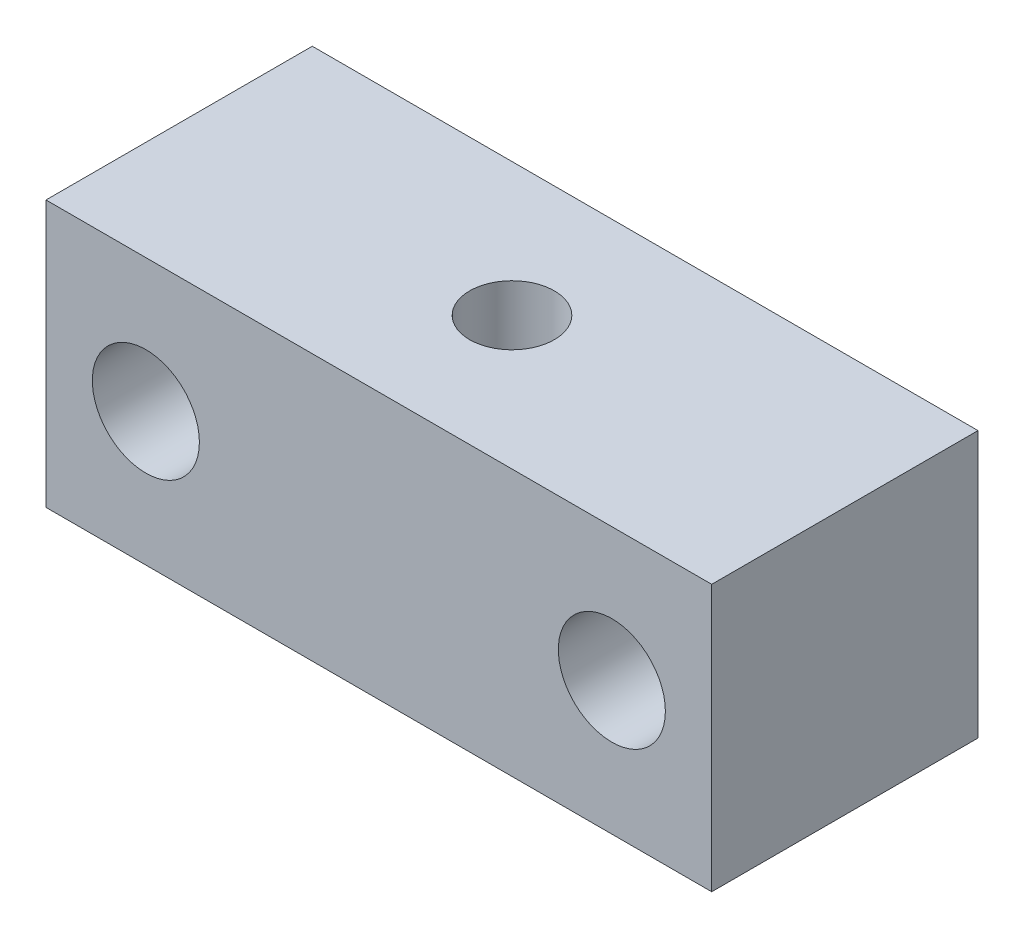
ISO-10303-21;
HEADER;
FILE_DESCRIPTION(('STEP AP214'),'2;1');
FILE_NAME('part.step','',(''),(''),'','','');
FILE_SCHEMA(('AUTOMOTIVE_DESIGN { 1 0 10303 214 1 1 1 1 }'));
ENDSEC;
DATA;
#1=APPLICATION_CONTEXT('core data for automotive mechanical design processes');
#2=APPLICATION_PROTOCOL_DEFINITION('international standard','automotive_design',2000,#1);
#3=PRODUCT_CONTEXT('',#1,'mechanical');
#4=PRODUCT('Part','Part','',(#3));
#5=PRODUCT_RELATED_PRODUCT_CATEGORY('part','',(#4));
#6=PRODUCT_DEFINITION_FORMATION('','',#4);
#7=PRODUCT_DEFINITION_CONTEXT('part definition',#1,'design');
#8=PRODUCT_DEFINITION('design','',#6,#7);
#9=PRODUCT_DEFINITION_SHAPE('','',#8);
#10=(LENGTH_UNIT() NAMED_UNIT(*) SI_UNIT(.MILLI.,.METRE.));
#11=(NAMED_UNIT(*) PLANE_ANGLE_UNIT() SI_UNIT($,.RADIAN.));
#12=(NAMED_UNIT(*) SI_UNIT($,.STERADIAN.) SOLID_ANGLE_UNIT());
#13=UNCERTAINTY_MEASURE_WITH_UNIT(LENGTH_MEASURE(1.E-05),#10,'distance_accuracy_value','');
#14=(GEOMETRIC_REPRESENTATION_CONTEXT(3) GLOBAL_UNCERTAINTY_ASSIGNED_CONTEXT((#13)) GLOBAL_UNIT_ASSIGNED_CONTEXT((#10,
#11,#12)) REPRESENTATION_CONTEXT('',''));
#15=CARTESIAN_POINT('',(0.,0.,0.));
#16=DIRECTION('',(0.,0.,1.));
#17=DIRECTION('',(1.,0.,0.));
#18=AXIS2_PLACEMENT_3D('',#15,#16,#17);
#19=CARTESIAN_POINT('',(0.,0.,6.35));
#20=DIRECTION('',(1.,0.,0.));
#21=DIRECTION('',(0.,0.,-1.));
#22=AXIS2_PLACEMENT_3D('',#19,#20,#21);
#23=PLANE('',#22);
#24=DIRECTION('',(0.,-1.,0.));
#25=VECTOR('',#24,1.);
#26=CARTESIAN_POINT('',(0.,0.,-6.35));
#27=LINE('',#26,#25);
#28=CARTESIAN_POINT('',(0.,12.7,-6.35));
#29=VERTEX_POINT('',#28);
#30=CARTESIAN_POINT('',(0.,0.,-6.35));
#31=VERTEX_POINT('',#30);
#32=EDGE_CURVE('E102',#29,#31,#27,.T.);
#33=ORIENTED_EDGE('',*,*,#32,.T.);
#34=DIRECTION('',(0.,0.,-1.));
#35=VECTOR('',#34,1.);
#36=CARTESIAN_POINT('',(0.,0.,6.35));
#37=LINE('',#36,#35);
#38=CARTESIAN_POINT('',(0.,0.,6.35));
#39=VERTEX_POINT('',#38);
#40=EDGE_CURVE('E11',#39,#31,#37,.T.);
#41=ORIENTED_EDGE('',*,*,#40,.F.);
#42=DIRECTION('',(0.,-1.,0.));
#43=VECTOR('',#42,1.);
#44=CARTESIAN_POINT('',(0.,0.,6.35));
#45=LINE('',#44,#43);
#46=CARTESIAN_POINT('',(0.,12.7,6.35));
#47=VERTEX_POINT('',#46);
#48=EDGE_CURVE('E90',#47,#39,#45,.T.);
#49=ORIENTED_EDGE('',*,*,#48,.F.);
#50=DIRECTION('',(0.,0.,-1.));
#51=VECTOR('',#50,1.);
#52=CARTESIAN_POINT('',(0.,12.7,6.35));
#53=LINE('',#52,#51);
#54=EDGE_CURVE('E98',#47,#29,#53,.T.);
#55=ORIENTED_EDGE('',*,*,#54,.T.);
#56=EDGE_LOOP('',(#33,#41,#49,#55));
#57=FACE_BOUND('',#56,.T.);
#58=ADVANCED_FACE('F39',(#57),#23,.F.);
#59=CARTESIAN_POINT('',(0.,0.,6.35));
#60=DIRECTION('',(0.,1.,0.));
#61=DIRECTION('',(0.,0.,1.));
#62=AXIS2_PLACEMENT_3D('',#59,#60,#61);
#63=PLANE('',#62);
#64=CARTESIAN_POINT('',(15.875,0.,0.));
#65=DIRECTION('',(0.,1.,0.));
#66=DIRECTION('',(0.,0.,1.));
#67=AXIS2_PLACEMENT_3D('',#64,#65,#66);
#68=CIRCLE('',#67,2.0193);
#69=CARTESIAN_POINT('',(15.875,0.,2.0193));
#70=VERTEX_POINT('',#69);
#71=EDGE_CURVE('E120',#70,#70,#68,.T.);
#72=ORIENTED_EDGE('',*,*,#71,.T.);
#73=EDGE_LOOP('',(#72));
#74=FACE_BOUND('',#73,.T.);
#75=DIRECTION('',(1.,0.,0.));
#76=VECTOR('',#75,1.);
#77=CARTESIAN_POINT('',(0.,0.,-6.35));
#78=LINE('',#77,#76);
#79=CARTESIAN_POINT('',(31.75,0.,-6.35));
#80=VERTEX_POINT('',#79);
#81=EDGE_CURVE('E94',#31,#80,#78,.T.);
#82=ORIENTED_EDGE('',*,*,#81,.T.);
#83=DIRECTION('',(0.,0.,-1.));
#84=VECTOR('',#83,1.);
#85=CARTESIAN_POINT('',(31.75,0.,6.35));
#86=LINE('',#85,#84);
#87=CARTESIAN_POINT('',(31.75,0.,6.35));
#88=VERTEX_POINT('',#87);
#89=EDGE_CURVE('E47',#88,#80,#86,.T.);
#90=ORIENTED_EDGE('',*,*,#89,.F.);
#91=DIRECTION('',(1.,0.,0.));
#92=VECTOR('',#91,1.);
#93=CARTESIAN_POINT('',(0.,0.,6.35));
#94=LINE('',#93,#92);
#95=EDGE_CURVE('E85',#39,#88,#94,.T.);
#96=ORIENTED_EDGE('',*,*,#95,.F.);
#97=ORIENTED_EDGE('',*,*,#40,.T.);
#98=EDGE_LOOP('',(#82,#90,#96,#97));
#99=FACE_BOUND('',#98,.T.);
#100=ADVANCED_FACE('F93',(#74,#99),#63,.F.);
#101=CARTESIAN_POINT('',(31.75,0.,6.35));
#102=DIRECTION('',(-1.,0.,0.));
#103=DIRECTION('',(0.,0.,1.));
#104=AXIS2_PLACEMENT_3D('',#101,#102,#103);
#105=PLANE('',#104);
#106=DIRECTION('',(0.,1.,0.));
#107=VECTOR('',#106,1.);
#108=CARTESIAN_POINT('',(31.75,0.,-6.35));
#109=LINE('',#108,#107);
#110=CARTESIAN_POINT('',(31.75,12.7,-6.35));
#111=VERTEX_POINT('',#110);
#112=EDGE_CURVE('E72',#80,#111,#109,.T.);
#113=ORIENTED_EDGE('',*,*,#112,.T.);
#114=DIRECTION('',(0.,0.,-1.));
#115=VECTOR('',#114,1.);
#116=CARTESIAN_POINT('',(31.75,12.7,6.35));
#117=LINE('',#116,#115);
#118=CARTESIAN_POINT('',(31.75,12.7,6.35));
#119=VERTEX_POINT('',#118);
#120=EDGE_CURVE('E95',#119,#111,#117,.T.);
#121=ORIENTED_EDGE('',*,*,#120,.F.);
#122=DIRECTION('',(0.,1.,0.));
#123=VECTOR('',#122,1.);
#124=CARTESIAN_POINT('',(31.75,0.,6.35));
#125=LINE('',#124,#123);
#126=EDGE_CURVE('E88',#88,#119,#125,.T.);
#127=ORIENTED_EDGE('',*,*,#126,.F.);
#128=ORIENTED_EDGE('',*,*,#89,.T.);
#129=EDGE_LOOP('',(#113,#121,#127,#128));
#130=FACE_BOUND('',#129,.T.);
#131=ADVANCED_FACE('F96',(#130),#105,.F.);
#132=CARTESIAN_POINT('',(0.,12.7,6.35));
#133=DIRECTION('',(0.,-1.,0.));
#134=DIRECTION('',(0.,0.,-1.));
#135=AXIS2_PLACEMENT_3D('',#132,#133,#134);
#136=PLANE('',#135);
#137=CARTESIAN_POINT('',(15.875,12.7,0.));
#138=DIRECTION('',(0.,1.,0.));
#139=DIRECTION('',(0.,0.,1.));
#140=AXIS2_PLACEMENT_3D('',#137,#138,#139);
#141=CIRCLE('',#140,2.01929999999999);
#142=CARTESIAN_POINT('',(15.875,12.7,2.01929999999999));
#143=VERTEX_POINT('',#142);
#144=EDGE_CURVE('E130',#143,#143,#141,.T.);
#145=ORIENTED_EDGE('',*,*,#144,.F.);
#146=EDGE_LOOP('',(#145));
#147=FACE_BOUND('',#146,.T.);
#148=DIRECTION('',(-1.,0.,0.));
#149=VECTOR('',#148,1.);
#150=CARTESIAN_POINT('',(0.,12.7,-6.35));
#151=LINE('',#150,#149);
#152=EDGE_CURVE('E78',#111,#29,#151,.T.);
#153=ORIENTED_EDGE('',*,*,#152,.T.);
#154=ORIENTED_EDGE('',*,*,#54,.F.);
#155=DIRECTION('',(-1.,0.,0.));
#156=VECTOR('',#155,1.);
#157=CARTESIAN_POINT('',(0.,12.7,6.35));
#158=LINE('',#157,#156);
#159=EDGE_CURVE('E55',#119,#47,#158,.T.);
#160=ORIENTED_EDGE('',*,*,#159,.F.);
#161=ORIENTED_EDGE('',*,*,#120,.T.);
#162=EDGE_LOOP('',(#153,#154,#160,#161));
#163=FACE_BOUND('',#162,.T.);
#164=ADVANCED_FACE('F110',(#147,#163),#136,.F.);
#165=CARTESIAN_POINT('',(0.,0.,6.35));
#166=DIRECTION('',(0.,0.,-1.));
#167=DIRECTION('',(-1.,0.,0.));
#168=AXIS2_PLACEMENT_3D('',#165,#166,#167);
#169=PLANE('',#168);
#170=CARTESIAN_POINT('',(4.7625,6.35,6.35));
#171=DIRECTION('',(0.,0.,1.));
#172=DIRECTION('',(1.,0.,0.));
#173=AXIS2_PLACEMENT_3D('',#170,#171,#172);
#174=CIRCLE('',#173,2.5527);
#175=CARTESIAN_POINT('',(7.3152,6.35,6.35));
#176=VERTEX_POINT('',#175);
#177=EDGE_CURVE('E123',#176,#176,#174,.T.);
#178=ORIENTED_EDGE('',*,*,#177,.F.);
#179=EDGE_LOOP('',(#178));
#180=FACE_BOUND('',#179,.T.);
#181=CARTESIAN_POINT('',(26.9875,6.35,6.35));
#182=DIRECTION('',(0.,0.,1.));
#183=DIRECTION('',(1.,0.,0.));
#184=AXIS2_PLACEMENT_3D('',#181,#182,#183);
#185=CIRCLE('',#184,2.5527);
#186=CARTESIAN_POINT('',(29.5402,6.35,6.35));
#187=VERTEX_POINT('',#186);
#188=EDGE_CURVE('E116',#187,#187,#185,.T.);
#189=ORIENTED_EDGE('',*,*,#188,.F.);
#190=EDGE_LOOP('',(#189));
#191=FACE_BOUND('',#190,.T.);
#192=ORIENTED_EDGE('',*,*,#48,.T.);
#193=ORIENTED_EDGE('',*,*,#95,.T.);
#194=ORIENTED_EDGE('',*,*,#126,.T.);
#195=ORIENTED_EDGE('',*,*,#159,.T.);
#196=EDGE_LOOP('',(#192,#193,#194,#195));
#197=FACE_BOUND('',#196,.T.);
#198=ADVANCED_FACE('F86',(#180,#191,#197),#169,.F.);
#199=CARTESIAN_POINT('',(0.,0.,-6.35));
#200=DIRECTION('',(0.,0.,-1.));
#201=DIRECTION('',(-1.,0.,0.));
#202=AXIS2_PLACEMENT_3D('',#199,#200,#201);
#203=PLANE('',#202);
#204=CARTESIAN_POINT('',(4.7625,6.35,-6.35));
#205=DIRECTION('',(0.,0.,1.));
#206=DIRECTION('',(1.,0.,0.));
#207=AXIS2_PLACEMENT_3D('',#204,#205,#206);
#208=CIRCLE('',#207,2.5527);
#209=CARTESIAN_POINT('',(7.3152,6.35,-6.35));
#210=VERTEX_POINT('',#209);
#211=EDGE_CURVE('E105',#210,#210,#208,.T.);
#212=ORIENTED_EDGE('',*,*,#211,.T.);
#213=EDGE_LOOP('',(#212));
#214=FACE_BOUND('',#213,.T.);
#215=CARTESIAN_POINT('',(26.9875,6.35,-6.35));
#216=DIRECTION('',(0.,0.,1.));
#217=DIRECTION('',(1.,0.,0.));
#218=AXIS2_PLACEMENT_3D('',#215,#216,#217);
#219=CIRCLE('',#218,2.5527);
#220=CARTESIAN_POINT('',(29.5402,6.35,-6.35));
#221=VERTEX_POINT('',#220);
#222=EDGE_CURVE('E119',#221,#221,#219,.T.);
#223=ORIENTED_EDGE('',*,*,#222,.T.);
#224=EDGE_LOOP('',(#223));
#225=FACE_BOUND('',#224,.T.);
#226=ORIENTED_EDGE('',*,*,#32,.F.);
#227=ORIENTED_EDGE('',*,*,#152,.F.);
#228=ORIENTED_EDGE('',*,*,#112,.F.);
#229=ORIENTED_EDGE('',*,*,#81,.F.);
#230=EDGE_LOOP('',(#226,#227,#228,#229));
#231=FACE_BOUND('',#230,.T.);
#232=ADVANCED_FACE('F113',(#214,#225,#231),#203,.T.);
#233=CARTESIAN_POINT('',(26.9875,6.35,-6.35));
#234=DIRECTION('',(0.,0.,1.));
#235=DIRECTION('',(1.,0.,0.));
#236=AXIS2_PLACEMENT_3D('',#233,#234,#235);
#237=CYLINDRICAL_SURFACE('',#236,2.5527);
#238=ORIENTED_EDGE('',*,*,#222,.F.);
#239=EDGE_LOOP('',(#238));
#240=FACE_BOUND('',#239,.T.);
#241=ORIENTED_EDGE('',*,*,#188,.T.);
#242=EDGE_LOOP('',(#241));
#243=FACE_BOUND('',#242,.T.);
#244=ADVANCED_FACE('F161',(#240,#243),#237,.F.);
#245=CARTESIAN_POINT('',(4.7625,6.35,-6.35));
#246=DIRECTION('',(0.,0.,1.));
#247=DIRECTION('',(1.,0.,0.));
#248=AXIS2_PLACEMENT_3D('',#245,#246,#247);
#249=CYLINDRICAL_SURFACE('',#248,2.5527);
#250=ORIENTED_EDGE('',*,*,#211,.F.);
#251=EDGE_LOOP('',(#250));
#252=FACE_BOUND('',#251,.T.);
#253=ORIENTED_EDGE('',*,*,#177,.T.);
#254=EDGE_LOOP('',(#253));
#255=FACE_BOUND('',#254,.T.);
#256=ADVANCED_FACE('F156',(#252,#255),#249,.F.);
#257=CARTESIAN_POINT('',(15.875,12.7,0.));
#258=DIRECTION('',(0.,1.,0.));
#259=DIRECTION('',(0.,0.,1.));
#260=AXIS2_PLACEMENT_3D('',#257,#258,#259);
#261=CYLINDRICAL_SURFACE('',#260,2.01929999999999);
#262=ORIENTED_EDGE('',*,*,#71,.F.);
#263=EDGE_LOOP('',(#262));
#264=FACE_BOUND('',#263,.T.);
#265=ORIENTED_EDGE('',*,*,#144,.T.);
#266=EDGE_LOOP('',(#265));
#267=FACE_BOUND('',#266,.T.);
#268=ADVANCED_FACE('F134',(#264,#267),#261,.F.);
#269=CLOSED_SHELL('',(#58,#100,#131,#164,#198,#232,#244,#256,#268));
#270=MANIFOLD_SOLID_BREP('B2',#269);
#271=ADVANCED_BREP_SHAPE_REPRESENTATION('',(#18,#270),#14);
#272=SHAPE_DEFINITION_REPRESENTATION(#9,#271);
ENDSEC;
END-ISO-10303-21;
